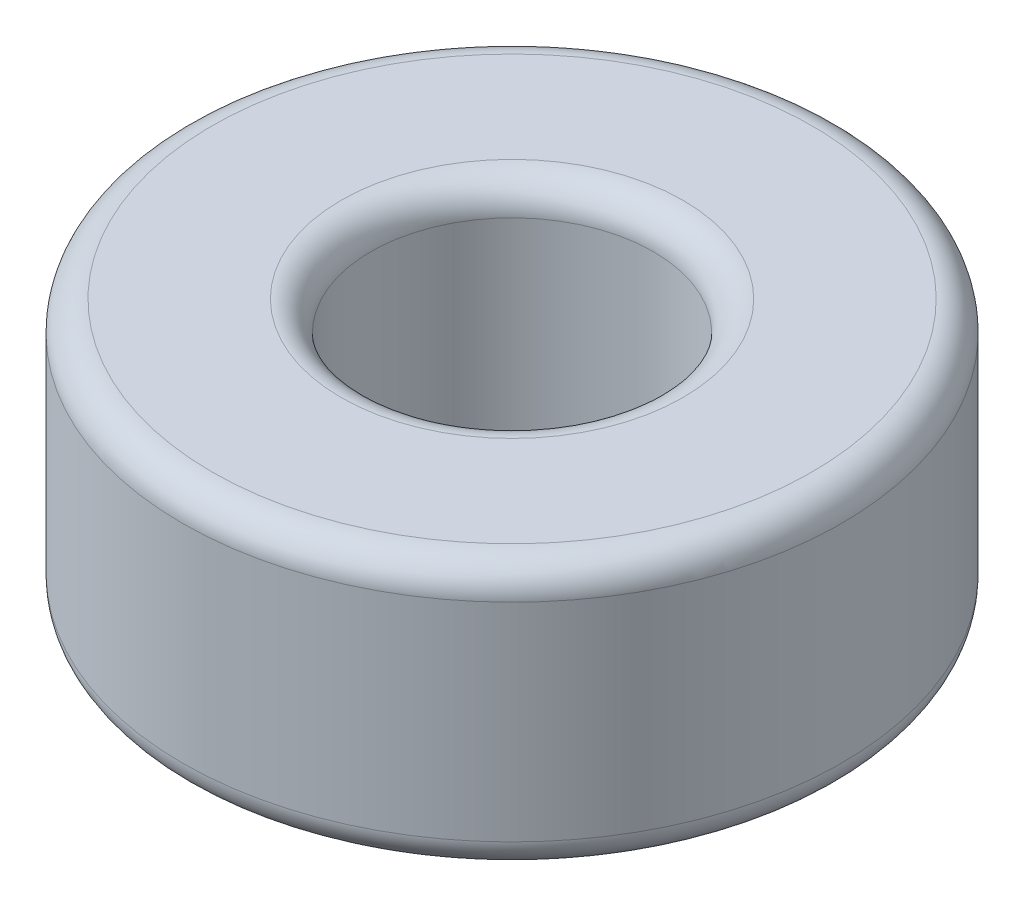
ISO-10303-21;
HEADER;
FILE_DESCRIPTION(('STEP AP214'),'2;1');
FILE_NAME('part.step','',(''),(''),'','','');
FILE_SCHEMA(('AUTOMOTIVE_DESIGN { 1 0 10303 214 1 1 1 1 }'));
ENDSEC;
DATA;
#1=APPLICATION_CONTEXT('core data for automotive mechanical design processes');
#2=APPLICATION_PROTOCOL_DEFINITION('international standard','automotive_design',2000,#1);
#3=PRODUCT_CONTEXT('',#1,'mechanical');
#4=PRODUCT('Part','Part','',(#3));
#5=PRODUCT_RELATED_PRODUCT_CATEGORY('part','',(#4));
#6=PRODUCT_DEFINITION_FORMATION('','',#4);
#7=PRODUCT_DEFINITION_CONTEXT('part definition',#1,'design');
#8=PRODUCT_DEFINITION('design','',#6,#7);
#9=PRODUCT_DEFINITION_SHAPE('','',#8);
#10=(LENGTH_UNIT() NAMED_UNIT(*) SI_UNIT(.MILLI.,.METRE.));
#11=(NAMED_UNIT(*) PLANE_ANGLE_UNIT() SI_UNIT($,.RADIAN.));
#12=(NAMED_UNIT(*) SI_UNIT($,.STERADIAN.) SOLID_ANGLE_UNIT());
#13=UNCERTAINTY_MEASURE_WITH_UNIT(LENGTH_MEASURE(1.E-05),#10,'distance_accuracy_value','');
#14=(GEOMETRIC_REPRESENTATION_CONTEXT(3) GLOBAL_UNCERTAINTY_ASSIGNED_CONTEXT((#13)) GLOBAL_UNIT_ASSIGNED_CONTEXT((#10,
#11,#12)) REPRESENTATION_CONTEXT('',''));
#15=CARTESIAN_POINT('',(0.,0.,0.));
#16=DIRECTION('',(0.,0.,1.));
#17=DIRECTION('',(1.,0.,0.));
#18=AXIS2_PLACEMENT_3D('',#15,#16,#17);
#19=CARTESIAN_POINT('',(0.,-4.5,0.));
#20=DIRECTION('',(0.,1.,0.));
#21=DIRECTION('',(0.,0.,1.));
#22=AXIS2_PLACEMENT_3D('',#19,#20,#21);
#23=CYLINDRICAL_SURFACE('',#22,11.1125);
#24=CARTESIAN_POINT('',(0.,3.5,0.));
#25=DIRECTION('',(0.,1.,0.));
#26=DIRECTION('',(0.,0.,1.));
#27=AXIS2_PLACEMENT_3D('',#24,#25,#26);
#28=CIRCLE('',#27,11.1125);
#29=CARTESIAN_POINT('',(0.,3.5,11.1125));
#30=VERTEX_POINT('',#29);
#31=EDGE_CURVE('E38',#30,#30,#28,.F.);
#32=ORIENTED_EDGE('',*,*,#31,.T.);
#33=EDGE_LOOP('',(#32));
#34=FACE_BOUND('',#33,.T.);
#35=CARTESIAN_POINT('',(0.,-3.5,0.));
#36=DIRECTION('',(0.,1.,0.));
#37=DIRECTION('',(0.,0.,1.));
#38=AXIS2_PLACEMENT_3D('',#35,#36,#37);
#39=CIRCLE('',#38,11.1125);
#40=CARTESIAN_POINT('',(0.,-3.5,11.1125));
#41=VERTEX_POINT('',#40);
#42=EDGE_CURVE('E42',#41,#41,#39,.T.);
#43=ORIENTED_EDGE('',*,*,#42,.T.);
#44=EDGE_LOOP('',(#43));
#45=FACE_BOUND('',#44,.T.);
#46=ADVANCED_FACE('F31',(#34,#45),#23,.T.);
#47=CARTESIAN_POINT('',(0.,-4.5,0.));
#48=DIRECTION('',(0.,1.,0.));
#49=DIRECTION('',(0.,0.,1.));
#50=AXIS2_PLACEMENT_3D('',#47,#48,#49);
#51=PLANE('',#50);
#52=CARTESIAN_POINT('',(0.,-4.5,0.));
#53=DIRECTION('',(0.,1.,0.));
#54=DIRECTION('',(0.,0.,1.));
#55=AXIS2_PLACEMENT_3D('',#52,#53,#54);
#56=CIRCLE('',#55,10.1125);
#57=CARTESIAN_POINT('',(0.,-4.5,10.1125));
#58=VERTEX_POINT('',#57);
#59=EDGE_CURVE('E10',#58,#58,#56,.F.);
#60=ORIENTED_EDGE('',*,*,#59,.T.);
#61=EDGE_LOOP('',(#60));
#62=FACE_BOUND('',#61,.T.);
#63=CARTESIAN_POINT('',(0.,-4.5,0.));
#64=DIRECTION('',(0.,1.,0.));
#65=DIRECTION('',(0.,0.,1.));
#66=AXIS2_PLACEMENT_3D('',#63,#64,#65);
#67=CIRCLE('',#66,5.7625);
#68=CARTESIAN_POINT('',(0.,-4.5,5.7625));
#69=VERTEX_POINT('',#68);
#70=EDGE_CURVE('E60',#69,#69,#67,.T.);
#71=ORIENTED_EDGE('',*,*,#70,.T.);
#72=EDGE_LOOP('',(#71));
#73=FACE_BOUND('',#72,.T.);
#74=ADVANCED_FACE('F64',(#62,#73),#51,.F.);
#75=CARTESIAN_POINT('',(0.,-4.5,0.));
#76=DIRECTION('',(0.,1.,0.));
#77=DIRECTION('',(0.,0.,1.));
#78=AXIS2_PLACEMENT_3D('',#75,#76,#77);
#79=CYLINDRICAL_SURFACE('',#78,4.7625);
#80=CARTESIAN_POINT('',(0.,-3.5,0.));
#81=DIRECTION('',(0.,1.,0.));
#82=DIRECTION('',(0.,0.,1.));
#83=AXIS2_PLACEMENT_3D('',#80,#81,#82);
#84=CIRCLE('',#83,4.7625);
#85=CARTESIAN_POINT('',(0.,-3.5,4.7625));
#86=VERTEX_POINT('',#85);
#87=EDGE_CURVE('E54',#86,#86,#84,.F.);
#88=ORIENTED_EDGE('',*,*,#87,.T.);
#89=EDGE_LOOP('',(#88));
#90=FACE_BOUND('',#89,.T.);
#91=CARTESIAN_POINT('',(0.,3.5,0.));
#92=DIRECTION('',(0.,1.,0.));
#93=DIRECTION('',(0.,0.,1.));
#94=AXIS2_PLACEMENT_3D('',#91,#92,#93);
#95=CIRCLE('',#94,4.7625);
#96=CARTESIAN_POINT('',(0.,3.5,4.7625));
#97=VERTEX_POINT('',#96);
#98=EDGE_CURVE('E57',#97,#97,#95,.T.);
#99=ORIENTED_EDGE('',*,*,#98,.T.);
#100=EDGE_LOOP('',(#99));
#101=FACE_BOUND('',#100,.T.);
#102=ADVANCED_FACE('F79',(#90,#101),#79,.F.);
#103=CARTESIAN_POINT('',(0.,4.5,0.));
#104=DIRECTION('',(0.,1.,0.));
#105=DIRECTION('',(0.,0.,1.));
#106=AXIS2_PLACEMENT_3D('',#103,#104,#105);
#107=PLANE('',#106);
#108=CARTESIAN_POINT('',(0.,4.5,0.));
#109=DIRECTION('',(0.,1.,0.));
#110=DIRECTION('',(0.,0.,1.));
#111=AXIS2_PLACEMENT_3D('',#108,#109,#110);
#112=CIRCLE('',#111,10.1125);
#113=CARTESIAN_POINT('',(0.,4.5,10.1125));
#114=VERTEX_POINT('',#113);
#115=EDGE_CURVE('E46',#114,#114,#112,.T.);
#116=ORIENTED_EDGE('',*,*,#115,.T.);
#117=EDGE_LOOP('',(#116));
#118=FACE_BOUND('',#117,.T.);
#119=CARTESIAN_POINT('',(0.,4.5,0.));
#120=DIRECTION('',(0.,1.,0.));
#121=DIRECTION('',(0.,0.,1.));
#122=AXIS2_PLACEMENT_3D('',#119,#120,#121);
#123=CIRCLE('',#122,5.7625);
#124=CARTESIAN_POINT('',(0.,4.5,5.7625));
#125=VERTEX_POINT('',#124);
#126=EDGE_CURVE('E51',#125,#125,#123,.F.);
#127=ORIENTED_EDGE('',*,*,#126,.T.);
#128=EDGE_LOOP('',(#127));
#129=FACE_BOUND('',#128,.T.);
#130=ADVANCED_FACE('F69',(#118,#129),#107,.T.);
#131=CARTESIAN_POINT('',(0.,-3.5,0.));
#132=DIRECTION('',(0.,1.,0.));
#133=DIRECTION('',(0.,0.,1.));
#134=AXIS2_PLACEMENT_3D('',#131,#132,#133);
#135=TOROIDAL_SURFACE('',#134,5.7625,1.);
#136=ORIENTED_EDGE('',*,*,#87,.F.);
#137=EDGE_LOOP('',(#136));
#138=FACE_BOUND('',#137,.T.);
#139=ORIENTED_EDGE('',*,*,#70,.F.);
#140=EDGE_LOOP('',(#139));
#141=FACE_BOUND('',#140,.T.);
#142=ADVANCED_FACE('F66',(#138,#141),#135,.T.);
#143=CARTESIAN_POINT('',(0.,3.5,0.));
#144=DIRECTION('',(0.,1.,0.));
#145=DIRECTION('',(0.,0.,1.));
#146=AXIS2_PLACEMENT_3D('',#143,#144,#145);
#147=TOROIDAL_SURFACE('',#146,5.7625,1.);
#148=ORIENTED_EDGE('',*,*,#126,.F.);
#149=EDGE_LOOP('',(#148));
#150=FACE_BOUND('',#149,.T.);
#151=ORIENTED_EDGE('',*,*,#98,.F.);
#152=EDGE_LOOP('',(#151));
#153=FACE_BOUND('',#152,.T.);
#154=ADVANCED_FACE('F68',(#150,#153),#147,.T.);
#155=CARTESIAN_POINT('',(0.,3.5,0.));
#156=DIRECTION('',(0.,1.,0.));
#157=DIRECTION('',(0.,0.,1.));
#158=AXIS2_PLACEMENT_3D('',#155,#156,#157);
#159=TOROIDAL_SURFACE('',#158,10.1125,1.);
#160=ORIENTED_EDGE('',*,*,#31,.F.);
#161=EDGE_LOOP('',(#160));
#162=FACE_BOUND('',#161,.T.);
#163=ORIENTED_EDGE('',*,*,#115,.F.);
#164=EDGE_LOOP('',(#163));
#165=FACE_BOUND('',#164,.T.);
#166=ADVANCED_FACE('F76',(#162,#165),#159,.T.);
#167=CARTESIAN_POINT('',(0.,-3.5,0.));
#168=DIRECTION('',(0.,1.,0.));
#169=DIRECTION('',(0.,0.,1.));
#170=AXIS2_PLACEMENT_3D('',#167,#168,#169);
#171=TOROIDAL_SURFACE('',#170,10.1125,1.);
#172=ORIENTED_EDGE('',*,*,#59,.F.);
#173=EDGE_LOOP('',(#172));
#174=FACE_BOUND('',#173,.T.);
#175=ORIENTED_EDGE('',*,*,#42,.F.);
#176=EDGE_LOOP('',(#175));
#177=FACE_BOUND('',#176,.T.);
#178=ADVANCED_FACE('F33',(#174,#177),#171,.T.);
#179=CLOSED_SHELL('',(#46,#74,#102,#130,#142,#154,#166,#178));
#180=MANIFOLD_SOLID_BREP('B2',#179);
#181=ADVANCED_BREP_SHAPE_REPRESENTATION('',(#18,#180),#14);
#182=SHAPE_DEFINITION_REPRESENTATION(#9,#181);
ENDSEC;
END-ISO-10303-21;
